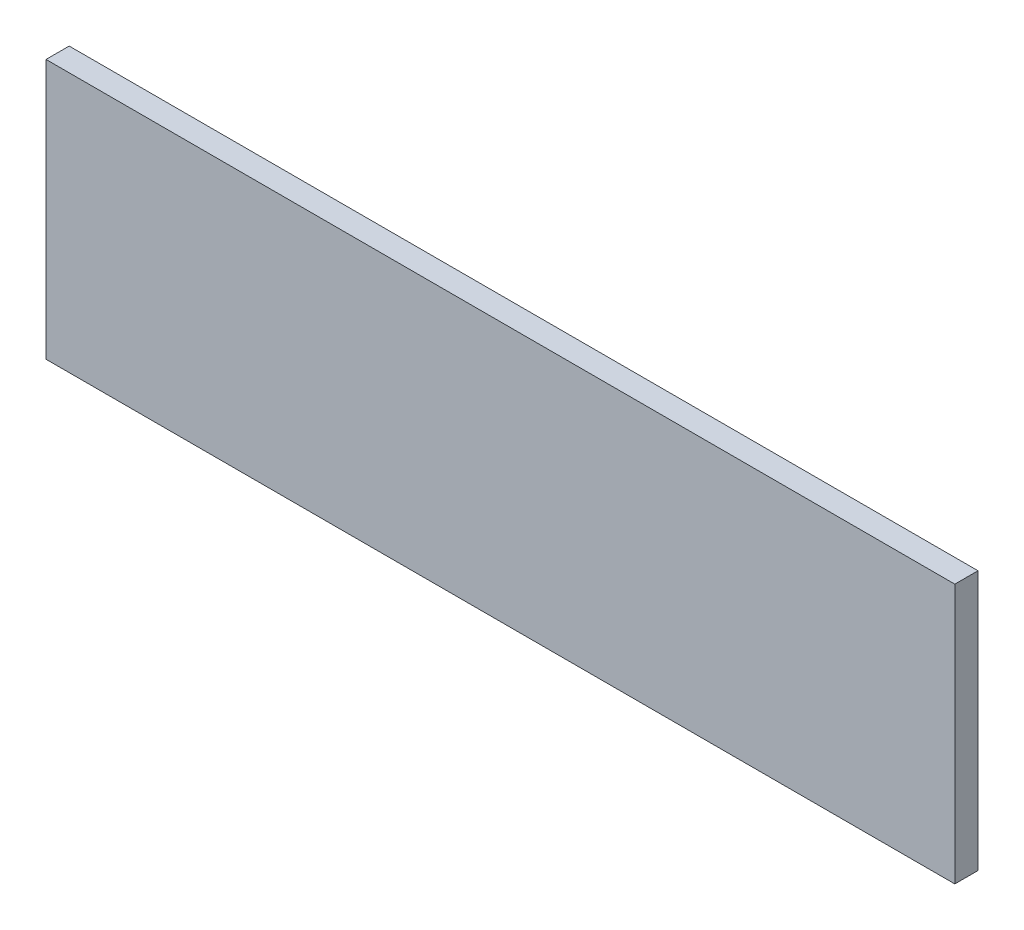
ISO-10303-21;
HEADER;
FILE_DESCRIPTION(('STEP AP214'),'2;1');
FILE_NAME('part.step','',(''),(''),'','','');
FILE_SCHEMA(('AUTOMOTIVE_DESIGN { 1 0 10303 214 1 1 1 1 }'));
ENDSEC;
DATA;
#1=APPLICATION_CONTEXT('core data for automotive mechanical design processes');
#2=APPLICATION_PROTOCOL_DEFINITION('international standard','automotive_design',2000,#1);
#3=PRODUCT_CONTEXT('',#1,'mechanical');
#4=PRODUCT('Part','Part','',(#3));
#5=PRODUCT_RELATED_PRODUCT_CATEGORY('part','',(#4));
#6=PRODUCT_DEFINITION_FORMATION('','',#4);
#7=PRODUCT_DEFINITION_CONTEXT('part definition',#1,'design');
#8=PRODUCT_DEFINITION('design','',#6,#7);
#9=PRODUCT_DEFINITION_SHAPE('','',#8);
#10=(LENGTH_UNIT() NAMED_UNIT(*) SI_UNIT(.MILLI.,.METRE.));
#11=(NAMED_UNIT(*) PLANE_ANGLE_UNIT() SI_UNIT($,.RADIAN.));
#12=(NAMED_UNIT(*) SI_UNIT($,.STERADIAN.) SOLID_ANGLE_UNIT());
#13=UNCERTAINTY_MEASURE_WITH_UNIT(LENGTH_MEASURE(1.E-05),#10,'distance_accuracy_value','');
#14=(GEOMETRIC_REPRESENTATION_CONTEXT(3) GLOBAL_UNCERTAINTY_ASSIGNED_CONTEXT((#13)) GLOBAL_UNIT_ASSIGNED_CONTEXT((#10,
#11,#12)) REPRESENTATION_CONTEXT('',''));
#15=CARTESIAN_POINT('',(0.,0.,0.));
#16=DIRECTION('',(0.,0.,1.));
#17=DIRECTION('',(1.,0.,0.));
#18=AXIS2_PLACEMENT_3D('',#15,#16,#17);
#19=CARTESIAN_POINT('',(248.92,0.,0.));
#20=DIRECTION('',(0.,1.,0.));
#21=DIRECTION('',(0.,0.,1.));
#22=AXIS2_PLACEMENT_3D('',#19,#20,#21);
#23=PLANE('',#22);
#24=DIRECTION('',(0.,0.,-1.));
#25=VECTOR('',#24,1.);
#26=CARTESIAN_POINT('',(0.,0.,0.));
#27=LINE('',#26,#25);
#28=CARTESIAN_POINT('',(0.,0.,6.35));
#29=VERTEX_POINT('',#28);
#30=CARTESIAN_POINT('',(0.,0.,0.));
#31=VERTEX_POINT('',#30);
#32=EDGE_CURVE('E113',#29,#31,#27,.T.);
#33=ORIENTED_EDGE('',*,*,#32,.T.);
#34=DIRECTION('',(-1.,0.,0.));
#35=VECTOR('',#34,1.);
#36=CARTESIAN_POINT('',(248.92,0.,0.));
#37=LINE('',#36,#35);
#38=CARTESIAN_POINT('',(248.92,0.,0.));
#39=VERTEX_POINT('',#38);
#40=EDGE_CURVE('E11',#39,#31,#37,.T.);
#41=ORIENTED_EDGE('',*,*,#40,.F.);
#42=DIRECTION('',(0.,0.,-1.));
#43=VECTOR('',#42,1.);
#44=CARTESIAN_POINT('',(248.92,0.,0.));
#45=LINE('',#44,#43);
#46=CARTESIAN_POINT('',(248.92,0.,6.35));
#47=VERTEX_POINT('',#46);
#48=EDGE_CURVE('E97',#47,#39,#45,.T.);
#49=ORIENTED_EDGE('',*,*,#48,.F.);
#50=DIRECTION('',(-1.,0.,0.));
#51=VECTOR('',#50,1.);
#52=CARTESIAN_POINT('',(248.92,0.,6.35));
#53=LINE('',#52,#51);
#54=EDGE_CURVE('E109',#47,#29,#53,.T.);
#55=ORIENTED_EDGE('',*,*,#54,.T.);
#56=EDGE_LOOP('',(#33,#41,#49,#55));
#57=FACE_BOUND('',#56,.T.);
#58=ADVANCED_FACE('F45',(#57),#23,.F.);
#59=CARTESIAN_POINT('',(248.92,0.,0.));
#60=DIRECTION('',(0.,0.,1.));
#61=DIRECTION('',(1.,0.,0.));
#62=AXIS2_PLACEMENT_3D('',#59,#60,#61);
#63=PLANE('',#62);
#64=DIRECTION('',(0.,1.,0.));
#65=VECTOR('',#64,1.);
#66=CARTESIAN_POINT('',(0.,0.,0.));
#67=LINE('',#66,#65);
#68=CARTESIAN_POINT('',(0.,71.12,0.));
#69=VERTEX_POINT('',#68);
#70=EDGE_CURVE('E102',#31,#69,#67,.T.);
#71=ORIENTED_EDGE('',*,*,#70,.T.);
#72=DIRECTION('',(-1.,0.,0.));
#73=VECTOR('',#72,1.);
#74=CARTESIAN_POINT('',(248.92,71.12,0.));
#75=LINE('',#74,#73);
#76=CARTESIAN_POINT('',(248.92,71.12,0.));
#77=VERTEX_POINT('',#76);
#78=EDGE_CURVE('E54',#77,#69,#75,.T.);
#79=ORIENTED_EDGE('',*,*,#78,.F.);
#80=DIRECTION('',(0.,1.,0.));
#81=VECTOR('',#80,1.);
#82=CARTESIAN_POINT('',(248.92,0.,0.));
#83=LINE('',#82,#81);
#84=EDGE_CURVE('E92',#39,#77,#83,.T.);
#85=ORIENTED_EDGE('',*,*,#84,.F.);
#86=ORIENTED_EDGE('',*,*,#40,.T.);
#87=EDGE_LOOP('',(#71,#79,#85,#86));
#88=FACE_BOUND('',#87,.T.);
#89=ADVANCED_FACE('F101',(#88),#63,.F.);
#90=CARTESIAN_POINT('',(248.92,71.12,0.));
#91=DIRECTION('',(0.,-1.,0.));
#92=DIRECTION('',(0.,0.,-1.));
#93=AXIS2_PLACEMENT_3D('',#90,#91,#92);
#94=PLANE('',#93);
#95=DIRECTION('',(0.,0.,1.));
#96=VECTOR('',#95,1.);
#97=CARTESIAN_POINT('',(0.,71.12,0.));
#98=LINE('',#97,#96);
#99=CARTESIAN_POINT('',(0.,71.12,6.35));
#100=VERTEX_POINT('',#99);
#101=EDGE_CURVE('E79',#69,#100,#98,.T.);
#102=ORIENTED_EDGE('',*,*,#101,.T.);
#103=DIRECTION('',(-1.,0.,0.));
#104=VECTOR('',#103,1.);
#105=CARTESIAN_POINT('',(248.92,71.12,6.35));
#106=LINE('',#105,#104);
#107=CARTESIAN_POINT('',(248.92,71.12,6.35));
#108=VERTEX_POINT('',#107);
#109=EDGE_CURVE('E104',#108,#100,#106,.T.);
#110=ORIENTED_EDGE('',*,*,#109,.F.);
#111=DIRECTION('',(0.,0.,1.));
#112=VECTOR('',#111,1.);
#113=CARTESIAN_POINT('',(248.92,71.12,0.));
#114=LINE('',#113,#112);
#115=EDGE_CURVE('E95',#77,#108,#114,.T.);
#116=ORIENTED_EDGE('',*,*,#115,.F.);
#117=ORIENTED_EDGE('',*,*,#78,.T.);
#118=EDGE_LOOP('',(#102,#110,#116,#117));
#119=FACE_BOUND('',#118,.T.);
#120=ADVANCED_FACE('F105',(#119),#94,.F.);
#121=CARTESIAN_POINT('',(248.92,0.,6.35));
#122=DIRECTION('',(0.,0.,-1.));
#123=DIRECTION('',(-1.,0.,0.));
#124=AXIS2_PLACEMENT_3D('',#121,#122,#123);
#125=PLANE('',#124);
#126=DIRECTION('',(0.,-1.,0.));
#127=VECTOR('',#126,1.);
#128=CARTESIAN_POINT('',(0.,0.,6.35));
#129=LINE('',#128,#127);
#130=EDGE_CURVE('E85',#100,#29,#129,.T.);
#131=ORIENTED_EDGE('',*,*,#130,.T.);
#132=ORIENTED_EDGE('',*,*,#54,.F.);
#133=DIRECTION('',(0.,-1.,0.));
#134=VECTOR('',#133,1.);
#135=CARTESIAN_POINT('',(248.92,0.,6.35));
#136=LINE('',#135,#134);
#137=EDGE_CURVE('E62',#108,#47,#136,.T.);
#138=ORIENTED_EDGE('',*,*,#137,.F.);
#139=ORIENTED_EDGE('',*,*,#109,.T.);
#140=EDGE_LOOP('',(#131,#132,#138,#139));
#141=FACE_BOUND('',#140,.T.);
#142=ADVANCED_FACE('F126',(#141),#125,.F.);
#143=CARTESIAN_POINT('',(248.92,0.,0.));
#144=DIRECTION('',(-1.,0.,0.));
#145=DIRECTION('',(0.,0.,1.));
#146=AXIS2_PLACEMENT_3D('',#143,#144,#145);
#147=PLANE('',#146);
#148=ORIENTED_EDGE('',*,*,#48,.T.);
#149=ORIENTED_EDGE('',*,*,#84,.T.);
#150=ORIENTED_EDGE('',*,*,#115,.T.);
#151=ORIENTED_EDGE('',*,*,#137,.T.);
#152=EDGE_LOOP('',(#148,#149,#150,#151));
#153=FACE_BOUND('',#152,.T.);
#154=ADVANCED_FACE('F93',(#153),#147,.F.);
#155=CARTESIAN_POINT('',(0.,0.,0.));
#156=DIRECTION('',(-1.,0.,0.));
#157=DIRECTION('',(0.,0.,1.));
#158=AXIS2_PLACEMENT_3D('',#155,#156,#157);
#159=PLANE('',#158);
#160=ORIENTED_EDGE('',*,*,#32,.F.);
#161=ORIENTED_EDGE('',*,*,#130,.F.);
#162=ORIENTED_EDGE('',*,*,#101,.F.);
#163=ORIENTED_EDGE('',*,*,#70,.F.);
#164=EDGE_LOOP('',(#160,#161,#162,#163));
#165=FACE_BOUND('',#164,.T.);
#166=ADVANCED_FACE('F129',(#165),#159,.T.);
#167=CLOSED_SHELL('',(#58,#89,#120,#142,#154,#166));
#168=MANIFOLD_SOLID_BREP('B2',#167);
#169=ADVANCED_BREP_SHAPE_REPRESENTATION('',(#18,#168),#14);
#170=SHAPE_DEFINITION_REPRESENTATION(#9,#169);
ENDSEC;
END-ISO-10303-21;
